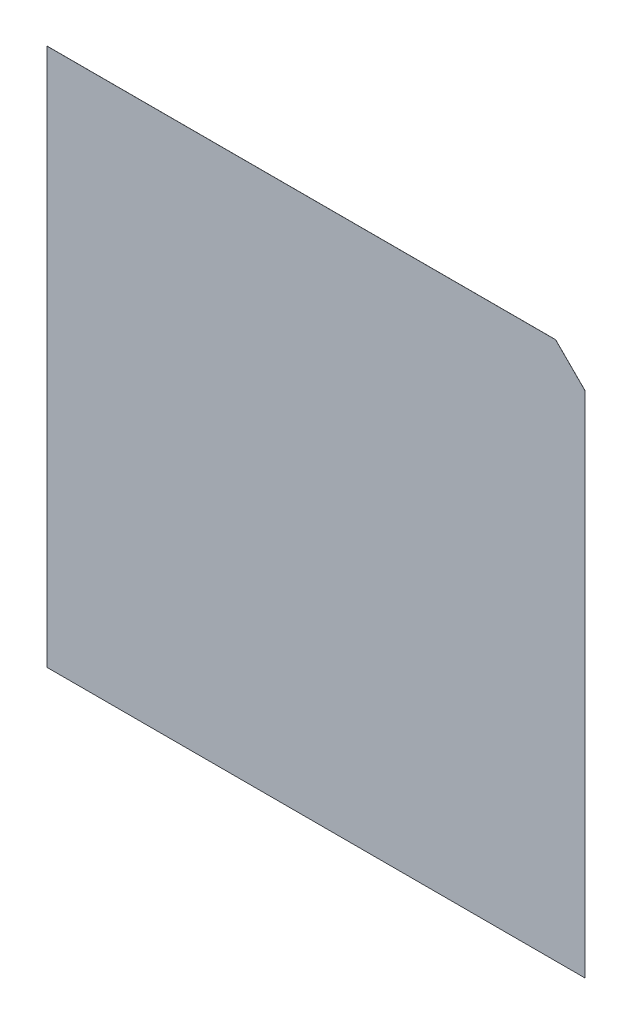
ISO-10303-21;
HEADER;
FILE_DESCRIPTION(('STEP AP214'),'2;1');
FILE_NAME('part.step','',(''),(''),'','','');
FILE_SCHEMA(('AUTOMOTIVE_DESIGN { 1 0 10303 214 1 1 1 1 }'));
ENDSEC;
DATA;
#1=APPLICATION_CONTEXT('core data for automotive mechanical design processes');
#2=APPLICATION_PROTOCOL_DEFINITION('international standard','automotive_design',2000,#1);
#3=PRODUCT_CONTEXT('',#1,'mechanical');
#4=PRODUCT('Part','Part','',(#3));
#5=PRODUCT_RELATED_PRODUCT_CATEGORY('part','',(#4));
#6=PRODUCT_DEFINITION_FORMATION('','',#4);
#7=PRODUCT_DEFINITION_CONTEXT('part definition',#1,'design');
#8=PRODUCT_DEFINITION('design','',#6,#7);
#9=PRODUCT_DEFINITION_SHAPE('','',#8);
#10=(LENGTH_UNIT() NAMED_UNIT(*) SI_UNIT(.MILLI.,.METRE.));
#11=(NAMED_UNIT(*) PLANE_ANGLE_UNIT() SI_UNIT($,.RADIAN.));
#12=(NAMED_UNIT(*) SI_UNIT($,.STERADIAN.) SOLID_ANGLE_UNIT());
#13=UNCERTAINTY_MEASURE_WITH_UNIT(LENGTH_MEASURE(1.E-05),#10,'distance_accuracy_value','');
#14=(GEOMETRIC_REPRESENTATION_CONTEXT(3) GLOBAL_UNCERTAINTY_ASSIGNED_CONTEXT((#13)) GLOBAL_UNIT_ASSIGNED_CONTEXT((#10,
#11,#12)) REPRESENTATION_CONTEXT('',''));
#15=CARTESIAN_POINT('',(0.,0.,0.));
#16=DIRECTION('',(0.,0.,1.));
#17=DIRECTION('',(1.,0.,0.));
#18=AXIS2_PLACEMENT_3D('',#15,#16,#17);
#19=CARTESIAN_POINT('',(10.0461605968744,0.415761119109168,-9.92430117054637E-05));
#20=CARTESIAN_POINT('',(10.0461605968744,0.415761119004261,0.0011007569882948));
#21=CARTESIAN_POINT('',(17.7261605968744,0.415760447702244,-9.924301176416E-05));
#22=CARTESIAN_POINT('',(17.7261605968744,0.415760447597337,0.00110075698823611));
#23=(BOUNDED_SURFACE() B_SPLINE_SURFACE(1,1,((#19,#20),(#21,#22)),.UNSPECIFIED.,.F.,.F.,
.F.) B_SPLINE_SURFACE_WITH_KNOTS((2,2),(2,2),(-0.00064,0.00704),(-1.10000000000016E-06,
1.00000000000109E-07),
.UNSPECIFIED.) GEOMETRIC_REPRESENTATION_ITEM() RATIONAL_B_SPLINE_SURFACE(((1.,1.),(1.,1.))) REPRESENTATION_ITEM('') SURFACE());
#24=CARTESIAN_POINT('',(17.0861605968744,0.415760503556656,0.00100075698824089));
#25=CARTESIAN_POINT('',(10.6861605968744,0.415761063062426,0.0010007569882898));
#26=(BOUNDED_CURVE() B_SPLINE_CURVE(1,(#24,#25),.UNSPECIFIED.,.F.,
.F.) B_SPLINE_CURVE_WITH_KNOTS((2,2),(0.,0.0064),
.UNSPECIFIED.) CURVE() GEOMETRIC_REPRESENTATION_ITEM() RATIONAL_B_SPLINE_CURVE((1.,1.)) REPRESENTATION_ITEM(''));
#27=CARTESIAN_POINT('',(17.0861605968744,0.415760503556656,0.00100075698824089));
#28=VERTEX_POINT('',#27);
#29=CARTESIAN_POINT('',(10.6861605968744,0.415761063062431,0.00100075698828989));
#30=VERTEX_POINT('',#29);
#31=EDGE_CURVE('E141',#28,#30,#26,.T.);
#32=CARTESIAN_POINT('',(10.6861605968744,0.415761063062431,0.00100075698828989));
#33=CARTESIAN_POINT('',(10.6861605968744,0.415761063149854,7.56988289760525E-07));
#34=(BOUNDED_CURVE() B_SPLINE_CURVE(1,(#32,#33),.UNSPECIFIED.,.F.,
.F.) B_SPLINE_CURVE_WITH_KNOTS((2,2),(0.,1.00000000000013E-06),
.UNSPECIFIED.) CURVE() GEOMETRIC_REPRESENTATION_ITEM() RATIONAL_B_SPLINE_CURVE((1.,1.)) REPRESENTATION_ITEM(''));
#35=CARTESIAN_POINT('',(10.6861605968744,0.415761063149861,7.56988289760119E-07));
#36=VERTEX_POINT('',#35);
#37=EDGE_CURVE('E11',#30,#36,#34,.T.);
#38=CARTESIAN_POINT('',(17.0861605968744,0.415760503644086,7.56988240754181E-07));
#39=CARTESIAN_POINT('',(10.6861605968744,0.415761063149856,7.56988289667707E-07));
#40=(BOUNDED_CURVE() B_SPLINE_CURVE(1,(#38,#39),.UNSPECIFIED.,.F.,
.F.) B_SPLINE_CURVE_WITH_KNOTS((2,2),(0.,0.0064),
.UNSPECIFIED.) CURVE() GEOMETRIC_REPRESENTATION_ITEM() RATIONAL_B_SPLINE_CURVE((1.,1.)) REPRESENTATION_ITEM(''));
#41=CARTESIAN_POINT('',(17.0861605968744,0.415760503644086,7.56988240754181E-07));
#42=VERTEX_POINT('',#41);
#43=EDGE_CURVE('E93',#42,#36,#40,.T.);
#44=CARTESIAN_POINT('',(17.0861605968744,0.415760503556656,0.00100075698824089));
#45=CARTESIAN_POINT('',(17.0861605968744,0.415760503644079,7.56988240754452E-07));
#46=(BOUNDED_CURVE() B_SPLINE_CURVE(1,(#44,#45),.UNSPECIFIED.,.F.,
.F.) B_SPLINE_CURVE_WITH_KNOTS((2,2),(0.,1.00000000000014E-06),
.UNSPECIFIED.) CURVE() GEOMETRIC_REPRESENTATION_ITEM() RATIONAL_B_SPLINE_CURVE((1.,1.)) REPRESENTATION_ITEM(''));
#47=EDGE_CURVE('E107',#28,#42,#46,.T.);
#48=ORIENTED_EDGE('',*,*,#31,.T.);
#49=ORIENTED_EDGE('',*,*,#37,.T.);
#50=ORIENTED_EDGE('',*,*,#43,.F.);
#51=ORIENTED_EDGE('',*,*,#47,.F.);
#52=EDGE_LOOP('',(#48,#49,#50,#51));
#53=FACE_BOUND('',#52,.T.);
#54=ADVANCED_FACE('F17',(#53),#23,.T.);
#55=CARTESIAN_POINT('',(10.6861612123307,7.45576106315856,-9.86275556634927E-05));
#56=CARTESIAN_POINT('',(10.6861612123307,7.45576106305365,0.00110137244433686));
#57=CARTESIAN_POINT('',(10.6861605409238,-0.224238936841401,-9.92989622601588E-05));
#58=CARTESIAN_POINT('',(10.6861605409238,-0.224238936946308,0.0011007010377402));
#59=(BOUNDED_SURFACE() B_SPLINE_SURFACE(1,1,((#55,#56),(#57,#58)),.UNSPECIFIED.,.F.,.F.,
.F.) B_SPLINE_SURFACE_WITH_KNOTS((2,2),(2,2),(-0.00064,0.00704),(-1.10000000000033E-06,
1.0000000000003E-07),
.UNSPECIFIED.) GEOMETRIC_REPRESENTATION_ITEM() RATIONAL_B_SPLINE_SURFACE(((1.,1.),(1.,1.))) REPRESENTATION_ITEM('') SURFACE());
#60=CARTESIAN_POINT('',(10.6861605968744,0.415761063062431,0.00100075698828989));
#61=CARTESIAN_POINT('',(10.6861611563802,6.81576106306239,0.00100131649378711));
#62=(BOUNDED_CURVE() B_SPLINE_CURVE(1,(#60,#61),.UNSPECIFIED.,.F.,
.F.) B_SPLINE_CURVE_WITH_KNOTS((2,2),(0.,0.0064),
.UNSPECIFIED.) CURVE() GEOMETRIC_REPRESENTATION_ITEM() RATIONAL_B_SPLINE_CURVE((1.,1.)) REPRESENTATION_ITEM(''));
#63=CARTESIAN_POINT('',(10.6861611563802,6.81576106306239,0.00100131649378695));
#64=VERTEX_POINT('',#63);
#65=EDGE_CURVE('E137',#30,#64,#62,.T.);
#66=CARTESIAN_POINT('',(10.6861611563802,6.81576106306239,0.00100131649378695));
#67=CARTESIAN_POINT('',(10.6861611563802,6.81576106314981,1.31649378681513E-06));
#68=(BOUNDED_CURVE() B_SPLINE_CURVE(1,(#66,#67),.UNSPECIFIED.,.F.,
.F.) B_SPLINE_CURVE_WITH_KNOTS((2,2),(0.,1.00000000000014E-06),
.UNSPECIFIED.) CURVE() GEOMETRIC_REPRESENTATION_ITEM() RATIONAL_B_SPLINE_CURVE((1.,1.)) REPRESENTATION_ITEM(''));
#69=CARTESIAN_POINT('',(10.6861611563802,6.81576106314982,1.31649378681473E-06));
#70=VERTEX_POINT('',#69);
#71=EDGE_CURVE('E32',#64,#70,#68,.T.);
#72=CARTESIAN_POINT('',(10.6861605968744,0.415761063149861,7.56988289760119E-07));
#73=CARTESIAN_POINT('',(10.6861611563802,6.81576106314982,1.31649378698193E-06));
#74=(BOUNDED_CURVE() B_SPLINE_CURVE(1,(#72,#73),.UNSPECIFIED.,.F.,
.F.) B_SPLINE_CURVE_WITH_KNOTS((2,2),(0.,0.0064),
.UNSPECIFIED.) CURVE() GEOMETRIC_REPRESENTATION_ITEM() RATIONAL_B_SPLINE_CURVE((1.,1.)) REPRESENTATION_ITEM(''));
#75=EDGE_CURVE('E86',#36,#70,#74,.T.);
#76=ORIENTED_EDGE('',*,*,#65,.T.);
#77=ORIENTED_EDGE('',*,*,#71,.T.);
#78=ORIENTED_EDGE('',*,*,#75,.F.);
#79=ORIENTED_EDGE('',*,*,#37,.F.);
#80=EDGE_LOOP('',(#76,#77,#78,#79));
#81=FACE_BOUND('',#80,.T.);
#82=ADVANCED_FACE('F135',(#81),#59,.T.);
#83=CARTESIAN_POINT('',(17.3411611563802,6.81576048135998,-9.86835062640883E-05));
#84=CARTESIAN_POINT('',(17.3411611563802,6.81576048125507,0.0011013164937364));
#85=CARTESIAN_POINT('',(10.0811611563802,6.81576111604933,-9.86835062086021E-05));
#86=CARTESIAN_POINT('',(10.0811611563802,6.81576111594443,0.00110131649379188));
#87=(BOUNDED_SURFACE() B_SPLINE_SURFACE(1,1,((#83,#84),(#85,#86)),.UNSPECIFIED.,.F.,.F.,
.F.) B_SPLINE_SURFACE_WITH_KNOTS((2,2),(2,2),(-0.000605,0.006655),(-1.10000000000018E-06,
1.00000000000309E-07),
.UNSPECIFIED.) GEOMETRIC_REPRESENTATION_ITEM() RATIONAL_B_SPLINE_SURFACE(((1.,1.),(1.,1.))) REPRESENTATION_ITEM('') SURFACE());
#88=CARTESIAN_POINT('',(10.6861611563802,6.81576106306239,0.00100131649378695));
#89=CARTESIAN_POINT('',(16.7361611563802,6.81576053415459,0.00100131649374071));
#90=(BOUNDED_CURVE() B_SPLINE_CURVE(1,(#88,#89),.UNSPECIFIED.,.F.,
.F.) B_SPLINE_CURVE_WITH_KNOTS((2,2),(0.,0.00605),
.UNSPECIFIED.) CURVE() GEOMETRIC_REPRESENTATION_ITEM() RATIONAL_B_SPLINE_CURVE((1.,1.)) REPRESENTATION_ITEM(''));
#91=CARTESIAN_POINT('',(16.7361611563802,6.81576053415459,0.00100131649374098));
#92=VERTEX_POINT('',#91);
#93=EDGE_CURVE('E69',#64,#92,#90,.T.);
#94=CARTESIAN_POINT('',(16.7361611563802,6.81576053415459,0.00100131649374098));
#95=CARTESIAN_POINT('',(16.7361611563802,6.81576053424201,1.31649374084483E-06));
#96=(BOUNDED_CURVE() B_SPLINE_CURVE(1,(#94,#95),.UNSPECIFIED.,.F.,
.F.) B_SPLINE_CURVE_WITH_KNOTS((2,2),(0.,1.00000000000014E-06),
.UNSPECIFIED.) CURVE() GEOMETRIC_REPRESENTATION_ITEM() RATIONAL_B_SPLINE_CURVE((1.,1.)) REPRESENTATION_ITEM(''));
#97=CARTESIAN_POINT('',(16.7361611563802,6.81576053424202,1.31649374084455E-06));
#98=VERTEX_POINT('',#97);
#99=EDGE_CURVE('E62',#92,#98,#96,.T.);
#100=CARTESIAN_POINT('',(10.6861611563802,6.81576106314982,1.31649378681473E-06));
#101=CARTESIAN_POINT('',(16.7361611563802,6.81576053424202,1.31649374057616E-06));
#102=(BOUNDED_CURVE() B_SPLINE_CURVE(1,(#100,#101),.UNSPECIFIED.,.F.,
.F.) B_SPLINE_CURVE_WITH_KNOTS((2,2),(0.,0.00605),
.UNSPECIFIED.) CURVE() GEOMETRIC_REPRESENTATION_ITEM() RATIONAL_B_SPLINE_CURVE((1.,1.)) REPRESENTATION_ITEM(''));
#103=EDGE_CURVE('E66',#70,#98,#102,.T.);
#104=ORIENTED_EDGE('',*,*,#93,.T.);
#105=ORIENTED_EDGE('',*,*,#99,.T.);
#106=ORIENTED_EDGE('',*,*,#103,.F.);
#107=ORIENTED_EDGE('',*,*,#71,.F.);
#108=EDGE_LOOP('',(#104,#105,#106,#107));
#109=FACE_BOUND('',#108,.T.);
#110=ADVANCED_FACE('F64',(#109),#87,.T.);
#111=CARTESIAN_POINT('',(17.1211611227224,6.43076050059301,-9.87171640146788E-05));
#112=CARTESIAN_POINT('',(17.1211611227224,6.4307605004881,0.00110128283598548));
#113=CARTESIAN_POINT('',(16.70116115944,6.85076053731056,-9.86804464632137E-05));
#114=CARTESIAN_POINT('',(16.70116115944,6.85076053720565,0.00110131955353695));
#115=(BOUNDED_SURFACE() B_SPLINE_SURFACE(1,1,((#111,#112),(#113,#114)),.UNSPECIFIED.,.F.,.F.,
.F.) B_SPLINE_SURFACE_WITH_KNOTS((2,2),(2,2),(-4.94974746830624E-05,0.000544472221513614),
(-1.10000000000015E-06,1.00000000000014E-07),
.UNSPECIFIED.) GEOMETRIC_REPRESENTATION_ITEM() RATIONAL_B_SPLINE_SURFACE(((1.,1.),(1.,1.))) REPRESENTATION_ITEM('') SURFACE());
#116=CARTESIAN_POINT('',(16.7361611563802,6.81576053415459,0.00100131649374098));
#117=CARTESIAN_POINT('',(17.0861611257822,6.46576050355664,0.00100128589578143));
#118=(BOUNDED_CURVE() B_SPLINE_CURVE(1,(#116,#117),.UNSPECIFIED.,.F.,
.F.) B_SPLINE_CURVE_WITH_KNOTS((2,2),(0.,0.000494974746830557),
.UNSPECIFIED.) CURVE() GEOMETRIC_REPRESENTATION_ITEM() RATIONAL_B_SPLINE_CURVE((1.,1.)) REPRESENTATION_ITEM(''));
#119=CARTESIAN_POINT('',(17.0861611257822,6.46576050355663,0.00100128589578105));
#120=VERTEX_POINT('',#119);
#121=EDGE_CURVE('E145',#92,#120,#118,.T.);
#122=CARTESIAN_POINT('',(17.0861611257822,6.46576050355663,0.00100128589578105));
#123=CARTESIAN_POINT('',(17.0861611257822,6.46576050364405,1.28589578134885E-06));
#124=(BOUNDED_CURVE() B_SPLINE_CURVE(1,(#122,#123),.UNSPECIFIED.,.F.,
.F.) B_SPLINE_CURVE_WITH_KNOTS((2,2),(0.,9.99999999999701E-07),
.UNSPECIFIED.) CURVE() GEOMETRIC_REPRESENTATION_ITEM() RATIONAL_B_SPLINE_CURVE((1.,1.)) REPRESENTATION_ITEM(''));
#125=CARTESIAN_POINT('',(17.0861611257822,6.46576050364406,1.28589578134858E-06));
#126=VERTEX_POINT('',#125);
#127=EDGE_CURVE('E74',#120,#126,#124,.T.);
#128=CARTESIAN_POINT('',(16.7361611563802,6.81576053424202,1.31649374084455E-06));
#129=CARTESIAN_POINT('',(17.0861611257822,6.46576050364407,1.28589578129028E-06));
#130=(BOUNDED_CURVE() B_SPLINE_CURVE(1,(#128,#129),.UNSPECIFIED.,.F.,
.F.) B_SPLINE_CURVE_WITH_KNOTS((2,2),(0.,0.000494974746830557),
.UNSPECIFIED.) CURVE() GEOMETRIC_REPRESENTATION_ITEM() RATIONAL_B_SPLINE_CURVE((1.,1.)) REPRESENTATION_ITEM(''));
#131=EDGE_CURVE('E77',#98,#126,#130,.T.);
#132=ORIENTED_EDGE('',*,*,#121,.T.);
#133=ORIENTED_EDGE('',*,*,#127,.T.);
#134=ORIENTED_EDGE('',*,*,#131,.F.);
#135=ORIENTED_EDGE('',*,*,#99,.F.);
#136=EDGE_LOOP('',(#132,#133,#134,#135));
#137=FACE_BOUND('',#136,.T.);
#138=ADVANCED_FACE('F19',(#137),#115,.T.);
#139=CARTESIAN_POINT('',(17.0861605439836,-0.189239496347178,-9.92959025132933E-05));
#140=CARTESIAN_POINT('',(17.0861605439836,-0.189239496452085,0.00110070409748687));
#141=CARTESIAN_POINT('',(17.086161178673,7.0707605036528,-9.86612134648824E-05));
#142=CARTESIAN_POINT('',(17.086161178673,7.07076050354789,0.00110133878653528));
#143=(BOUNDED_SURFACE() B_SPLINE_SURFACE(1,1,((#139,#140),(#141,#142)),.UNSPECIFIED.,.F.,.F.,
.F.) B_SPLINE_SURFACE_WITH_KNOTS((2,2),(2,2),(-0.00060500000000001,0.006655),
(-1.09999999999997E-06,1.00000000000197E-07),
.UNSPECIFIED.) GEOMETRIC_REPRESENTATION_ITEM() RATIONAL_B_SPLINE_SURFACE(((1.,1.),(1.,1.))) REPRESENTATION_ITEM('') SURFACE());
#144=CARTESIAN_POINT('',(17.0861611257822,6.46576050355663,0.00100128589578105));
#145=CARTESIAN_POINT('',(17.0861605968744,0.415760503556656,0.00100075698824071));
#146=(BOUNDED_CURVE() B_SPLINE_CURVE(1,(#144,#145),.UNSPECIFIED.,.F.,
.F.) B_SPLINE_CURVE_WITH_KNOTS((2,2),(0.,0.00605),
.UNSPECIFIED.) CURVE() GEOMETRIC_REPRESENTATION_ITEM() RATIONAL_B_SPLINE_CURVE((1.,1.)) REPRESENTATION_ITEM(''));
#147=EDGE_CURVE('E23',#120,#28,#146,.T.);
#148=CARTESIAN_POINT('',(17.0861611257822,6.46576050364406,1.28589578134858E-06));
#149=CARTESIAN_POINT('',(17.0861605968744,0.415760503644086,7.56988241006084E-07));
#150=(BOUNDED_CURVE() B_SPLINE_CURVE(1,(#148,#149),.UNSPECIFIED.,.F.,
.F.) B_SPLINE_CURVE_WITH_KNOTS((2,2),(0.,0.00605),
.UNSPECIFIED.) CURVE() GEOMETRIC_REPRESENTATION_ITEM() RATIONAL_B_SPLINE_CURVE((1.,1.)) REPRESENTATION_ITEM(''));
#151=EDGE_CURVE('E83',#126,#42,#150,.T.);
#152=ORIENTED_EDGE('',*,*,#147,.T.);
#153=ORIENTED_EDGE('',*,*,#47,.T.);
#154=ORIENTED_EDGE('',*,*,#151,.F.);
#155=ORIENTED_EDGE('',*,*,#127,.F.);
#156=EDGE_LOOP('',(#152,#153,#154,#155));
#157=FACE_BOUND('',#156,.T.);
#158=ADVANCED_FACE('F196',(#157),#143,.T.);
#159=CARTESIAN_POINT('',(10.046160488033,-0.224238936937561,0.00100070103774008));
#160=CARTESIAN_POINT('',(10.04616115944,7.45576173446926,0.00100137244439544));
#161=CARTESIAN_POINT('',(17.7261611227224,-0.224239608344541,0.00100070103768139));
#162=CARTESIAN_POINT('',(17.7261617941294,7.45576106306228,0.00100137244433675));
#163=(BOUNDED_SURFACE() B_SPLINE_SURFACE(1,1,((#159,#160),(#161,#162)),.UNSPECIFIED.,.F.,.F.,
.F.) B_SPLINE_SURFACE_WITH_KNOTS((2,2),(2,2),(-0.00704000005289081,0.000640000581798593),
(-0.000640000055950574,0.00704000061545631),
.UNSPECIFIED.) GEOMETRIC_REPRESENTATION_ITEM() RATIONAL_B_SPLINE_SURFACE(((1.,1.),(1.,1.))) REPRESENTATION_ITEM('') SURFACE());
#164=ORIENTED_EDGE('',*,*,#147,.F.);
#165=ORIENTED_EDGE('',*,*,#121,.F.);
#166=ORIENTED_EDGE('',*,*,#93,.F.);
#167=ORIENTED_EDGE('',*,*,#65,.F.);
#168=ORIENTED_EDGE('',*,*,#31,.F.);
#169=EDGE_LOOP('',(#164,#165,#166,#167,#168));
#170=FACE_BOUND('',#169,.T.);
#171=ADVANCED_FACE('F144',(#170),#163,.T.);
#172=CARTESIAN_POINT('',(17.7261605409238,-0.224239552306488,7.01037686140647E-07));
#173=CARTESIAN_POINT('',(17.7261612123308,7.45576044769347,1.37244428280683E-06));
#174=CARTESIAN_POINT('',(10.0461605409238,-0.224238880899564,7.01037744836878E-07));
#175=CARTESIAN_POINT('',(10.0461612123307,7.45576111910039,1.37244434150306E-06));
#176=(BOUNDED_SURFACE() B_SPLINE_SURFACE(1,1,((#172,#173),(#174,#175)),.UNSPECIFIED.,.F.,.F.,
.F.) B_SPLINE_SURFACE_WITH_KNOTS((2,2),(2,2),(-0.00704,0.000640000000000014),(-0.00064,0.00704),
.UNSPECIFIED.) GEOMETRIC_REPRESENTATION_ITEM() RATIONAL_B_SPLINE_SURFACE(((1.,1.),(1.,1.))) REPRESENTATION_ITEM('') SURFACE());
#177=ORIENTED_EDGE('',*,*,#43,.T.);
#178=ORIENTED_EDGE('',*,*,#75,.T.);
#179=ORIENTED_EDGE('',*,*,#103,.T.);
#180=ORIENTED_EDGE('',*,*,#131,.T.);
#181=ORIENTED_EDGE('',*,*,#151,.T.);
#182=EDGE_LOOP('',(#177,#178,#179,#180,#181));
#183=FACE_BOUND('',#182,.T.);
#184=ADVANCED_FACE('F85',(#183),#176,.T.);
#185=CLOSED_SHELL('',(#54,#82,#110,#138,#158,#171,#184));
#186=MANIFOLD_SOLID_BREP('B1',#185);
#187=ADVANCED_BREP_SHAPE_REPRESENTATION('',(#18,#186),#14);
#188=SHAPE_DEFINITION_REPRESENTATION(#9,#187);
ENDSEC;
END-ISO-10303-21;
